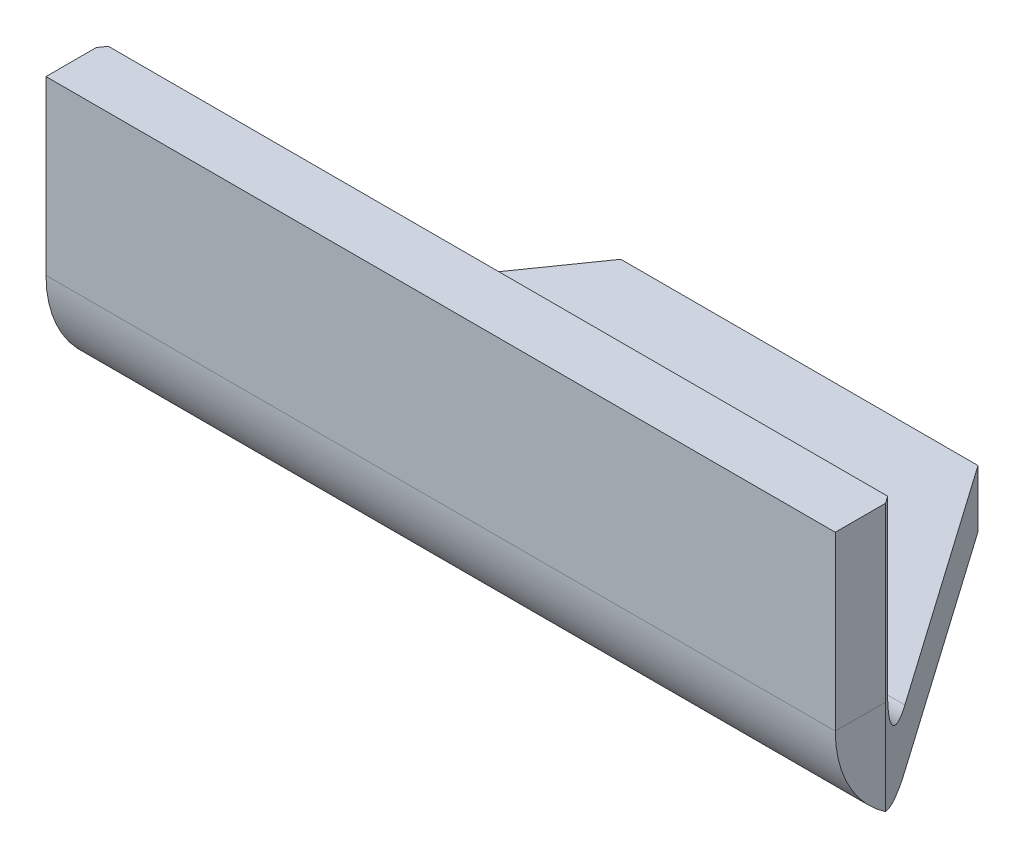
ISO-10303-21;
HEADER;
FILE_DESCRIPTION(('STEP AP214'),'2;1');
FILE_NAME('part.step','',(''),(''),'','','');
FILE_SCHEMA(('AUTOMOTIVE_DESIGN { 1 0 10303 214 1 1 1 1 }'));
ENDSEC;
DATA;
#1=APPLICATION_CONTEXT('core data for automotive mechanical design processes');
#2=APPLICATION_PROTOCOL_DEFINITION('international standard','automotive_design',2000,#1);
#3=PRODUCT_CONTEXT('',#1,'mechanical');
#4=PRODUCT('Part','Part','',(#3));
#5=PRODUCT_RELATED_PRODUCT_CATEGORY('part','',(#4));
#6=PRODUCT_DEFINITION_FORMATION('','',#4);
#7=PRODUCT_DEFINITION_CONTEXT('part definition',#1,'design');
#8=PRODUCT_DEFINITION('design','',#6,#7);
#9=PRODUCT_DEFINITION_SHAPE('','',#8);
#10=(LENGTH_UNIT() NAMED_UNIT(*) SI_UNIT(.MILLI.,.METRE.));
#11=(NAMED_UNIT(*) PLANE_ANGLE_UNIT() SI_UNIT($,.RADIAN.));
#12=(NAMED_UNIT(*) SI_UNIT($,.STERADIAN.) SOLID_ANGLE_UNIT());
#13=UNCERTAINTY_MEASURE_WITH_UNIT(LENGTH_MEASURE(1.E-05),#10,'distance_accuracy_value','');
#14=(GEOMETRIC_REPRESENTATION_CONTEXT(3) GLOBAL_UNCERTAINTY_ASSIGNED_CONTEXT((#13)) GLOBAL_UNIT_ASSIGNED_CONTEXT((#10,
#11,#12)) REPRESENTATION_CONTEXT('',''));
#15=CARTESIAN_POINT('',(0.,0.,0.));
#16=DIRECTION('',(0.,0.,1.));
#17=DIRECTION('',(1.,0.,0.));
#18=AXIS2_PLACEMENT_3D('',#15,#16,#17);
#19=CARTESIAN_POINT('',(0.,-8.,0.));
#20=DIRECTION('',(0.,-1.,0.));
#21=DIRECTION('',(0.,0.,-1.));
#22=AXIS2_PLACEMENT_3D('',#19,#20,#21);
#23=PLANE('',#22);
#24=DIRECTION('',(-1.,0.,0.));
#25=VECTOR('',#24,1.);
#26=CARTESIAN_POINT('',(-55.,-8.,-25.));
#27=LINE('',#26,#25);
#28=CARTESIAN_POINT('',(24.891075856982,-8.,-25.));
#29=VERTEX_POINT('',#28);
#30=CARTESIAN_POINT('',(-24.891075856982,-8.,-25.));
#31=VERTEX_POINT('',#30);
#32=EDGE_CURVE('E169',#29,#31,#27,.T.);
#33=ORIENTED_EDGE('',*,*,#32,.F.);
#34=DIRECTION('',(0.573576436351051,0.,0.819152044288988));
#35=VECTOR('',#34,1.);
#36=CARTESIAN_POINT('',(28.4483203543823,-8.,-19.9197283615434));
#37=LINE('',#36,#35);
#38=CARTESIAN_POINT('',(48.6981321561124,-8.00000000000003,9.00000000000002));
#39=VERTEX_POINT('',#38);
#40=EDGE_CURVE('E197',#39,#29,#37,.F.);
#41=ORIENTED_EDGE('',*,*,#40,.F.);
#42=DIRECTION('',(1.,0.,0.));
#43=VECTOR('',#42,1.);
#44=CARTESIAN_POINT('',(55.,-8.00000000000003,9.00000000000002));
#45=LINE('',#44,#43);
#46=CARTESIAN_POINT('',(-48.6981321561124,-8.00000000000003,9.00000000000002));
#47=VERTEX_POINT('',#46);
#48=EDGE_CURVE('E82',#39,#47,#45,.F.);
#49=ORIENTED_EDGE('',*,*,#48,.T.);
#50=DIRECTION('',(-0.573576436351051,0.,0.819152044288988));
#51=VECTOR('',#50,1.);
#52=CARTESIAN_POINT('',(-28.4483203543823,-8.,-19.9197283615434));
#53=LINE('',#52,#51);
#54=EDGE_CURVE('E13',#47,#31,#53,.F.);
#55=ORIENTED_EDGE('',*,*,#54,.T.);
#56=EDGE_LOOP('',(#33,#41,#49,#55));
#57=FACE_BOUND('',#56,.T.);
#58=ADVANCED_FACE('F59',(#57),#23,.T.);
#59=CARTESIAN_POINT('',(0.,0.,0.));
#60=DIRECTION('',(0.,-1.,0.));
#61=DIRECTION('',(0.,0.,-1.));
#62=AXIS2_PLACEMENT_3D('',#59,#60,#61);
#63=PLANE('',#62);
#64=DIRECTION('',(-0.573576436351051,0.,-0.819152044288988));
#65=VECTOR('',#64,1.);
#66=CARTESIAN_POINT('',(24.891075856982,0.,-25.));
#67=LINE('',#66,#65);
#68=CARTESIAN_POINT('',(24.891075856982,0.,-25.));
#69=VERTEX_POINT('',#68);
#70=CARTESIAN_POINT('',(48.6981321561124,0.,9.00000000000001));
#71=VERTEX_POINT('',#70);
#72=EDGE_CURVE('E204',#69,#71,#67,.F.);
#73=ORIENTED_EDGE('',*,*,#72,.F.);
#74=DIRECTION('',(-1.,0.,0.));
#75=VECTOR('',#74,1.);
#76=CARTESIAN_POINT('',(-55.,0.,-25.));
#77=LINE('',#76,#75);
#78=CARTESIAN_POINT('',(-24.891075856982,0.,-25.));
#79=VERTEX_POINT('',#78);
#80=EDGE_CURVE('E172',#69,#79,#77,.T.);
#81=ORIENTED_EDGE('',*,*,#80,.T.);
#82=DIRECTION('',(0.573576436351051,0.,-0.819152044288988));
#83=VECTOR('',#82,1.);
#84=CARTESIAN_POINT('',(-24.891075856982,0.,-25.));
#85=LINE('',#84,#83);
#86=CARTESIAN_POINT('',(-48.6981321561124,0.,9.00000000000001));
#87=VERTEX_POINT('',#86);
#88=EDGE_CURVE('E176',#79,#87,#85,.F.);
#89=ORIENTED_EDGE('',*,*,#88,.T.);
#90=DIRECTION('',(1.,0.,0.));
#91=VECTOR('',#90,1.);
#92=CARTESIAN_POINT('',(55.,0.,9.00000000000001));
#93=LINE('',#92,#91);
#94=EDGE_CURVE('E161',#71,#87,#93,.F.);
#95=ORIENTED_EDGE('',*,*,#94,.F.);
#96=EDGE_LOOP('',(#73,#81,#89,#95));
#97=FACE_BOUND('',#96,.T.);
#98=ADVANCED_FACE('F262',(#97),#63,.F.);
#99=CARTESIAN_POINT('',(-55.,-8.,-25.));
#100=DIRECTION('',(0.,0.,-1.));
#101=DIRECTION('',(-1.,0.,0.));
#102=AXIS2_PLACEMENT_3D('',#99,#100,#101);
#103=PLANE('',#102);
#104=ORIENTED_EDGE('',*,*,#80,.F.);
#105=DIRECTION('',(0.,1.,0.));
#106=VECTOR('',#105,1.);
#107=CARTESIAN_POINT('',(24.891075856982,-8.,-25.));
#108=LINE('',#107,#106);
#109=EDGE_CURVE('E202',#29,#69,#108,.T.);
#110=ORIENTED_EDGE('',*,*,#109,.F.);
#111=ORIENTED_EDGE('',*,*,#32,.T.);
#112=DIRECTION('',(0.,1.,0.));
#113=VECTOR('',#112,1.);
#114=CARTESIAN_POINT('',(-24.891075856982,-8.,-25.));
#115=LINE('',#114,#113);
#116=EDGE_CURVE('E171',#31,#79,#115,.T.);
#117=ORIENTED_EDGE('',*,*,#116,.T.);
#118=EDGE_LOOP('',(#104,#110,#111,#117));
#119=FACE_BOUND('',#118,.T.);
#120=ADVANCED_FACE('F201',(#119),#103,.T.);
#121=CARTESIAN_POINT('',(55.,7.99999999999997,9.00000000000001));
#122=DIRECTION('',(-1.,0.,0.));
#123=DIRECTION('',(0.,0.,1.));
#124=AXIS2_PLACEMENT_3D('',#121,#122,#123);
#125=PLANE('',#124);
#126=CARTESIAN_POINT('',(55.,7.99999999999997,9.00000000000001));
#127=DIRECTION('',(1.,0.,0.));
#128=DIRECTION('',(0.,0.,-1.));
#129=AXIS2_PLACEMENT_3D('',#126,#127,#128);
#130=CIRCLE('',#129,16.);
#131=CARTESIAN_POINT('',(55.,7.99999999999997,25.));
#132=VERTEX_POINT('',#131);
#133=CARTESIAN_POINT('',(55.,-5.22875655532285,18.0000000000002));
#134=VERTEX_POINT('',#133);
#135=EDGE_CURVE('E156',#132,#134,#130,.T.);
#136=ORIENTED_EDGE('',*,*,#135,.T.);
#137=DIRECTION('',(0.,-1.,0.));
#138=VECTOR('',#137,1.);
#139=CARTESIAN_POINT('',(55.,7.99999999999997,18.0000000000002));
#140=LINE('',#139,#138);
#141=CARTESIAN_POINT('',(55.,7.99999999999997,18.0000000000002));
#142=VERTEX_POINT('',#141);
#143=EDGE_CURVE('E142',#142,#134,#140,.T.);
#144=ORIENTED_EDGE('',*,*,#143,.F.);
#145=DIRECTION('',(0.,0.,-1.));
#146=VECTOR('',#145,1.);
#147=CARTESIAN_POINT('',(55.,7.99999999999997,17.));
#148=LINE('',#147,#146);
#149=EDGE_CURVE('E160',#142,#132,#148,.F.);
#150=ORIENTED_EDGE('',*,*,#149,.T.);
#151=EDGE_LOOP('',(#136,#144,#150));
#152=FACE_BOUND('',#151,.T.);
#153=ADVANCED_FACE('F159',(#152),#125,.F.);
#154=CARTESIAN_POINT('',(55.,7.99999999999997,9.00000000000001));
#155=DIRECTION('',(1.,0.,0.));
#156=DIRECTION('',(0.,0.,1.));
#157=AXIS2_PLACEMENT_3D('',#154,#155,#156);
#158=CYLINDRICAL_SURFACE('',#157,16.);
#159=ORIENTED_EDGE('',*,*,#48,.F.);
#160=CARTESIAN_POINT('',(48.6981321561124,7.99999999999997,9.00000000000001));
#161=DIRECTION('',(0.819152044288988,0.,-0.573576436351051));
#162=DIRECTION('',(-0.573576436351051,0.,-0.819152044288988));
#163=AXIS2_PLACEMENT_3D('',#160,#161,#162);
#164=ELLIPSE('',#163,19.5323934201834,16.);
#165=EDGE_CURVE('E145',#134,#39,#164,.T.);
#166=ORIENTED_EDGE('',*,*,#165,.F.);
#167=ORIENTED_EDGE('',*,*,#135,.F.);
#168=DIRECTION('',(1.,0.,0.));
#169=VECTOR('',#168,1.);
#170=CARTESIAN_POINT('',(-55.,7.99999999999997,25.));
#171=LINE('',#170,#169);
#172=CARTESIAN_POINT('',(-55.,7.99999999999997,25.));
#173=VERTEX_POINT('',#172);
#174=EDGE_CURVE('E226',#132,#173,#171,.F.);
#175=ORIENTED_EDGE('',*,*,#174,.T.);
#176=CARTESIAN_POINT('',(-55.,7.99999999999997,9.00000000000001));
#177=DIRECTION('',(1.,0.,0.));
#178=DIRECTION('',(0.,0.,-1.));
#179=AXIS2_PLACEMENT_3D('',#176,#177,#178);
#180=CIRCLE('',#179,16.);
#181=CARTESIAN_POINT('',(-55.,-5.22875655532285,18.0000000000002));
#182=VERTEX_POINT('',#181);
#183=EDGE_CURVE('E163',#182,#173,#180,.F.);
#184=ORIENTED_EDGE('',*,*,#183,.F.);
#185=CARTESIAN_POINT('',(-48.6981321561124,7.99999999999997,9.00000000000001));
#186=DIRECTION('',(0.819152044288988,0.,0.573576436351051));
#187=DIRECTION('',(0.573576436351051,0.,-0.819152044288988));
#188=AXIS2_PLACEMENT_3D('',#185,#186,#187);
#189=ELLIPSE('',#188,19.5323934201834,16.);
#190=EDGE_CURVE('E68',#182,#47,#189,.T.);
#191=ORIENTED_EDGE('',*,*,#190,.T.);
#192=EDGE_LOOP('',(#159,#166,#167,#175,#184,#191));
#193=FACE_BOUND('',#192,.T.);
#194=ADVANCED_FACE('F154',(#193),#158,.T.);
#195=CARTESIAN_POINT('',(55.,7.99999999999997,9.00000000000001));
#196=DIRECTION('',(1.,0.,0.));
#197=DIRECTION('',(0.,0.,1.));
#198=AXIS2_PLACEMENT_3D('',#195,#196,#197);
#199=CYLINDRICAL_SURFACE('',#198,8.);
#200=CARTESIAN_POINT('',(48.6981321561124,7.99999999999997,9.00000000000001));
#201=DIRECTION('',(0.819152044288988,0.,-0.573576436351051));
#202=DIRECTION('',(-0.573576436351051,0.,-0.819152044288988));
#203=AXIS2_PLACEMENT_3D('',#200,#201,#202);
#204=ELLIPSE('',#203,9.76619671009169,8.);
#205=CARTESIAN_POINT('',(54.2997924617902,7.99999999999997,17.));
#206=VERTEX_POINT('',#205);
#207=EDGE_CURVE('E208',#71,#206,#204,.F.);
#208=ORIENTED_EDGE('',*,*,#207,.F.);
#209=ORIENTED_EDGE('',*,*,#94,.T.);
#210=CARTESIAN_POINT('',(-48.6981321561124,7.99999999999997,9.00000000000001));
#211=DIRECTION('',(0.819152044288988,0.,0.573576436351051));
#212=DIRECTION('',(0.573576436351051,0.,-0.819152044288988));
#213=AXIS2_PLACEMENT_3D('',#210,#211,#212);
#214=ELLIPSE('',#213,9.76619671009169,8.);
#215=CARTESIAN_POINT('',(-54.2997924617902,7.99999999999997,17.));
#216=VERTEX_POINT('',#215);
#217=EDGE_CURVE('E179',#87,#216,#214,.F.);
#218=ORIENTED_EDGE('',*,*,#217,.T.);
#219=DIRECTION('',(1.,0.,0.));
#220=VECTOR('',#219,1.);
#221=CARTESIAN_POINT('',(-55.,7.99999999999997,17.));
#222=LINE('',#221,#220);
#223=EDGE_CURVE('E229',#216,#206,#222,.T.);
#224=ORIENTED_EDGE('',*,*,#223,.T.);
#225=EDGE_LOOP('',(#208,#209,#218,#224));
#226=FACE_BOUND('',#225,.T.);
#227=ADVANCED_FACE('F276',(#226),#199,.F.);
#228=CARTESIAN_POINT('',(55.,32.,25.));
#229=DIRECTION('',(-1.,0.,0.));
#230=DIRECTION('',(0.,-1.,0.));
#231=AXIS2_PLACEMENT_3D('',#228,#229,#230);
#232=PLANE('',#231);
#233=CARTESIAN_POINT('',(55.,32.,18.0000000000002));
#234=VERTEX_POINT('',#233);
#235=EDGE_CURVE('E147',#234,#142,#140,.T.);
#236=ORIENTED_EDGE('',*,*,#235,.F.);
#237=DIRECTION('',(0.,0.,-1.));
#238=VECTOR('',#237,1.);
#239=CARTESIAN_POINT('',(55.,32.,25.));
#240=LINE('',#239,#238);
#241=CARTESIAN_POINT('',(55.,32.,25.));
#242=VERTEX_POINT('',#241);
#243=EDGE_CURVE('E165',#242,#234,#240,.T.);
#244=ORIENTED_EDGE('',*,*,#243,.F.);
#245=DIRECTION('',(0.,1.,0.));
#246=VECTOR('',#245,1.);
#247=CARTESIAN_POINT('',(55.,0.,25.));
#248=LINE('',#247,#246);
#249=EDGE_CURVE('E219',#132,#242,#248,.T.);
#250=ORIENTED_EDGE('',*,*,#249,.F.);
#251=ORIENTED_EDGE('',*,*,#149,.F.);
#252=EDGE_LOOP('',(#236,#244,#250,#251));
#253=FACE_BOUND('',#252,.T.);
#254=ADVANCED_FACE('F281',(#253),#232,.F.);
#255=CARTESIAN_POINT('',(0.,0.,17.));
#256=DIRECTION('',(0.,0.,-1.));
#257=DIRECTION('',(-1.,0.,0.));
#258=AXIS2_PLACEMENT_3D('',#255,#256,#257);
#259=PLANE('',#258);
#260=DIRECTION('',(1.,0.,0.));
#261=VECTOR('',#260,1.);
#262=CARTESIAN_POINT('',(-55.,32.,17.));
#263=LINE('',#262,#261);
#264=CARTESIAN_POINT('',(54.2997924617901,32.,17.));
#265=VERTEX_POINT('',#264);
#266=CARTESIAN_POINT('',(-54.2997924617902,32.,17.));
#267=VERTEX_POINT('',#266);
#268=EDGE_CURVE('E224',#265,#267,#263,.F.);
#269=ORIENTED_EDGE('',*,*,#268,.F.);
#270=DIRECTION('',(0.,-1.,0.));
#271=VECTOR('',#270,1.);
#272=CARTESIAN_POINT('',(54.2997924617902,0.,17.));
#273=LINE('',#272,#271);
#274=EDGE_CURVE('E75',#206,#265,#273,.F.);
#275=ORIENTED_EDGE('',*,*,#274,.F.);
#276=ORIENTED_EDGE('',*,*,#223,.F.);
#277=DIRECTION('',(0.,-1.,0.));
#278=VECTOR('',#277,1.);
#279=CARTESIAN_POINT('',(-54.2997924617902,0.,17.));
#280=LINE('',#279,#278);
#281=EDGE_CURVE('E181',#216,#267,#280,.F.);
#282=ORIENTED_EDGE('',*,*,#281,.T.);
#283=EDGE_LOOP('',(#269,#275,#276,#282));
#284=FACE_BOUND('',#283,.T.);
#285=ADVANCED_FACE('F257',(#284),#259,.T.);
#286=CARTESIAN_POINT('',(-55.,32.,25.));
#287=DIRECTION('',(0.,-1.,0.));
#288=DIRECTION('',(0.,0.,-1.));
#289=AXIS2_PLACEMENT_3D('',#286,#287,#288);
#290=PLANE('',#289);
#291=DIRECTION('',(-0.573576436351051,0.,-0.819152044288988));
#292=VECTOR('',#291,1.);
#293=CARTESIAN_POINT('',(24.891075856982,32.,-25.));
#294=LINE('',#293,#292);
#295=EDGE_CURVE('E394',#265,#234,#294,.F.);
#296=ORIENTED_EDGE('',*,*,#295,.F.);
#297=ORIENTED_EDGE('',*,*,#268,.T.);
#298=DIRECTION('',(0.573576436351051,0.,-0.819152044288988));
#299=VECTOR('',#298,1.);
#300=CARTESIAN_POINT('',(-24.891075856982,32.,-25.));
#301=LINE('',#300,#299);
#302=CARTESIAN_POINT('',(-55.,32.,18.0000000000002));
#303=VERTEX_POINT('',#302);
#304=EDGE_CURVE('E184',#267,#303,#301,.F.);
#305=ORIENTED_EDGE('',*,*,#304,.T.);
#306=DIRECTION('',(0.,0.,-1.));
#307=VECTOR('',#306,1.);
#308=CARTESIAN_POINT('',(-55.,32.,25.));
#309=LINE('',#308,#307);
#310=CARTESIAN_POINT('',(-55.,32.,25.));
#311=VERTEX_POINT('',#310);
#312=EDGE_CURVE('E214',#311,#303,#309,.T.);
#313=ORIENTED_EDGE('',*,*,#312,.F.);
#314=DIRECTION('',(-1.,0.,0.));
#315=VECTOR('',#314,1.);
#316=CARTESIAN_POINT('',(0.,32.,25.));
#317=LINE('',#316,#315);
#318=EDGE_CURVE('E217',#242,#311,#317,.T.);
#319=ORIENTED_EDGE('',*,*,#318,.F.);
#320=ORIENTED_EDGE('',*,*,#243,.T.);
#321=EDGE_LOOP('',(#296,#297,#305,#313,#319,#320));
#322=FACE_BOUND('',#321,.T.);
#323=ADVANCED_FACE('F246',(#322),#290,.F.);
#324=CARTESIAN_POINT('',(-55.,7.99999999999997,9.00000000000001));
#325=DIRECTION('',(-1.,0.,0.));
#326=DIRECTION('',(0.,0.,1.));
#327=AXIS2_PLACEMENT_3D('',#324,#325,#326);
#328=PLANE('',#327);
#329=DIRECTION('',(0.,0.,-1.));
#330=VECTOR('',#329,1.);
#331=CARTESIAN_POINT('',(-55.,7.99999999999997,25.));
#332=LINE('',#331,#330);
#333=CARTESIAN_POINT('',(-55.,7.99999999999997,18.0000000000002));
#334=VERTEX_POINT('',#333);
#335=EDGE_CURVE('E206',#334,#173,#332,.F.);
#336=ORIENTED_EDGE('',*,*,#335,.F.);
#337=DIRECTION('',(0.,-1.,0.));
#338=VECTOR('',#337,1.);
#339=CARTESIAN_POINT('',(-55.,7.99999999999997,18.0000000000002));
#340=LINE('',#339,#338);
#341=EDGE_CURVE('E188',#334,#182,#340,.T.);
#342=ORIENTED_EDGE('',*,*,#341,.T.);
#343=ORIENTED_EDGE('',*,*,#183,.T.);
#344=EDGE_LOOP('',(#336,#342,#343));
#345=FACE_BOUND('',#344,.T.);
#346=ADVANCED_FACE('F249',(#345),#328,.T.);
#347=CARTESIAN_POINT('',(-55.,0.,25.));
#348=DIRECTION('',(1.,0.,0.));
#349=DIRECTION('',(0.,0.,-1.));
#350=AXIS2_PLACEMENT_3D('',#347,#348,#349);
#351=PLANE('',#350);
#352=ORIENTED_EDGE('',*,*,#312,.T.);
#353=DIRECTION('',(0.,1.,0.));
#354=VECTOR('',#353,1.);
#355=CARTESIAN_POINT('',(-55.,-8.,18.0000000000002));
#356=LINE('',#355,#354);
#357=EDGE_CURVE('E186',#303,#334,#356,.F.);
#358=ORIENTED_EDGE('',*,*,#357,.T.);
#359=ORIENTED_EDGE('',*,*,#335,.T.);
#360=DIRECTION('',(0.,-1.,0.));
#361=VECTOR('',#360,1.);
#362=CARTESIAN_POINT('',(-55.,0.,25.));
#363=LINE('',#362,#361);
#364=EDGE_CURVE('E221',#311,#173,#363,.T.);
#365=ORIENTED_EDGE('',*,*,#364,.F.);
#366=EDGE_LOOP('',(#352,#358,#359,#365));
#367=FACE_BOUND('',#366,.T.);
#368=ADVANCED_FACE('F236',(#367),#351,.F.);
#369=CARTESIAN_POINT('',(0.,0.,25.));
#370=DIRECTION('',(0.,0.,-1.));
#371=DIRECTION('',(-1.,0.,0.));
#372=AXIS2_PLACEMENT_3D('',#369,#370,#371);
#373=PLANE('',#372);
#374=ORIENTED_EDGE('',*,*,#174,.F.);
#375=ORIENTED_EDGE('',*,*,#249,.T.);
#376=ORIENTED_EDGE('',*,*,#318,.T.);
#377=ORIENTED_EDGE('',*,*,#364,.T.);
#378=EDGE_LOOP('',(#374,#375,#376,#377));
#379=FACE_BOUND('',#378,.T.);
#380=ADVANCED_FACE('F241',(#379),#373,.F.);
#381=CARTESIAN_POINT('',(-24.891075856982,-8.,-25.));
#382=DIRECTION('',(0.819152044288988,0.,0.573576436351051));
#383=DIRECTION('',(0.,1.,0.));
#384=AXIS2_PLACEMENT_3D('',#381,#382,#383);
#385=PLANE('',#384);
#386=ORIENTED_EDGE('',*,*,#190,.F.);
#387=ORIENTED_EDGE('',*,*,#341,.F.);
#388=ORIENTED_EDGE('',*,*,#357,.F.);
#389=ORIENTED_EDGE('',*,*,#304,.F.);
#390=ORIENTED_EDGE('',*,*,#281,.F.);
#391=ORIENTED_EDGE('',*,*,#217,.F.);
#392=ORIENTED_EDGE('',*,*,#88,.F.);
#393=ORIENTED_EDGE('',*,*,#116,.F.);
#394=ORIENTED_EDGE('',*,*,#54,.F.);
#395=EDGE_LOOP('',(#386,#387,#388,#389,#390,#391,#392,#393,#394));
#396=FACE_BOUND('',#395,.T.);
#397=ADVANCED_FACE('F62',(#396),#385,.F.);
#398=CARTESIAN_POINT('',(24.891075856982,-8.,-25.));
#399=DIRECTION('',(-0.819152044288988,0.,0.573576436351051));
#400=DIRECTION('',(0.,1.,0.));
#401=AXIS2_PLACEMENT_3D('',#398,#399,#400);
#402=PLANE('',#401);
#403=ORIENTED_EDGE('',*,*,#165,.T.);
#404=ORIENTED_EDGE('',*,*,#40,.T.);
#405=ORIENTED_EDGE('',*,*,#109,.T.);
#406=ORIENTED_EDGE('',*,*,#72,.T.);
#407=ORIENTED_EDGE('',*,*,#207,.T.);
#408=ORIENTED_EDGE('',*,*,#274,.T.);
#409=ORIENTED_EDGE('',*,*,#295,.T.);
#410=ORIENTED_EDGE('',*,*,#235,.T.);
#411=ORIENTED_EDGE('',*,*,#143,.T.);
#412=EDGE_LOOP('',(#403,#404,#405,#406,#407,#408,#409,#410,#411));
#413=FACE_BOUND('',#412,.T.);
#414=ADVANCED_FACE('F144',(#413),#402,.F.);
#415=CLOSED_SHELL('',(#58,#98,#120,#153,#194,#227,#254,#285,#323,#346,#368,#380,#397,#414));
#416=MANIFOLD_SOLID_BREP('B2',#415);
#417=ADVANCED_BREP_SHAPE_REPRESENTATION('',(#18,#416),#14);
#418=SHAPE_DEFINITION_REPRESENTATION(#9,#417);
ENDSEC;
END-ISO-10303-21;
